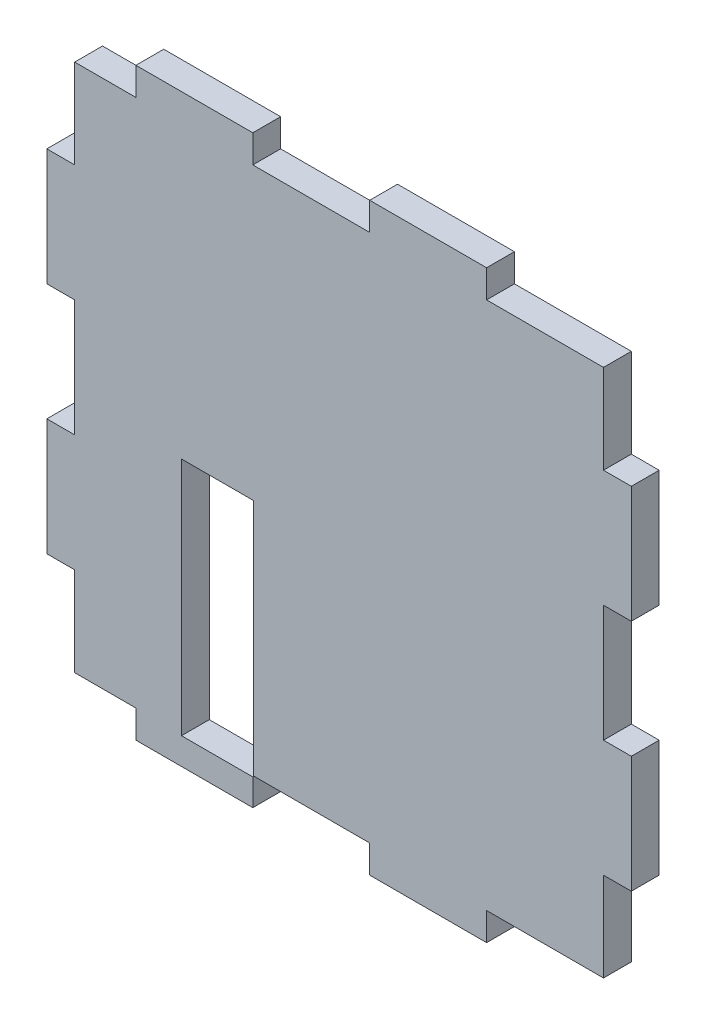
ISO-10303-21;
HEADER;
FILE_DESCRIPTION(('STEP AP214'),'2;1');
FILE_NAME('part.step','',(''),(''),'','','');
FILE_SCHEMA(('AUTOMOTIVE_DESIGN { 1 0 10303 214 1 1 1 1 }'));
ENDSEC;
DATA;
#1=APPLICATION_CONTEXT('core data for automotive mechanical design processes');
#2=APPLICATION_PROTOCOL_DEFINITION('international standard','automotive_design',2000,#1);
#3=PRODUCT_CONTEXT('',#1,'mechanical');
#4=PRODUCT('Part','Part','',(#3));
#5=PRODUCT_RELATED_PRODUCT_CATEGORY('part','',(#4));
#6=PRODUCT_DEFINITION_FORMATION('','',#4);
#7=PRODUCT_DEFINITION_CONTEXT('part definition',#1,'design');
#8=PRODUCT_DEFINITION('design','',#6,#7);
#9=PRODUCT_DEFINITION_SHAPE('','',#8);
#10=(LENGTH_UNIT() NAMED_UNIT(*) SI_UNIT(.MILLI.,.METRE.));
#11=(NAMED_UNIT(*) PLANE_ANGLE_UNIT() SI_UNIT($,.RADIAN.));
#12=(NAMED_UNIT(*) SI_UNIT($,.STERADIAN.) SOLID_ANGLE_UNIT());
#13=UNCERTAINTY_MEASURE_WITH_UNIT(LENGTH_MEASURE(1.E-05),#10,'distance_accuracy_value','');
#14=(GEOMETRIC_REPRESENTATION_CONTEXT(3) GLOBAL_UNCERTAINTY_ASSIGNED_CONTEXT((#13)) GLOBAL_UNIT_ASSIGNED_CONTEXT((#10,
#11,#12)) REPRESENTATION_CONTEXT('',''));
#15=CARTESIAN_POINT('',(0.,0.,0.));
#16=DIRECTION('',(0.,0.,1.));
#17=DIRECTION('',(1.,0.,0.));
#18=AXIS2_PLACEMENT_3D('',#15,#16,#17);
#19=CARTESIAN_POINT('',(0.,0.,0.));
#20=DIRECTION('',(0.,0.,1.));
#21=DIRECTION('',(1.,0.,0.));
#22=AXIS2_PLACEMENT_3D('',#19,#20,#21);
#23=PLANE('',#22);
#24=DIRECTION('',(1.,0.,0.));
#25=VECTOR('',#24,1.);
#26=CARTESIAN_POINT('',(0.,45.5655,0.));
#27=LINE('',#26,#25);
#28=CARTESIAN_POINT('',(-72.2,45.5655,0.));
#29=VERTEX_POINT('',#28);
#30=CARTESIAN_POINT('',(-59.878,45.5655,0.));
#31=VERTEX_POINT('',#30);
#32=EDGE_CURVE('E321',#29,#31,#27,.T.);
#33=ORIENTED_EDGE('',*,*,#32,.T.);
#34=DIRECTION('',(0.,-1.,0.));
#35=VECTOR('',#34,1.);
#36=CARTESIAN_POINT('',(-59.878,0.,0.));
#37=LINE('',#36,#35);
#38=CARTESIAN_POINT('',(-59.878,4.7625,0.));
#39=VERTEX_POINT('',#38);
#40=EDGE_CURVE('E302',#31,#39,#37,.T.);
#41=ORIENTED_EDGE('',*,*,#40,.T.);
#42=DIRECTION('',(1.,0.,0.));
#43=VECTOR('',#42,1.);
#44=CARTESIAN_POINT('',(4.7625,4.7625,0.));
#45=LINE('',#44,#43);
#46=CARTESIAN_POINT('',(-40.,4.7625,0.));
#47=VERTEX_POINT('',#46);
#48=EDGE_CURVE('E419',#39,#47,#45,.T.);
#49=ORIENTED_EDGE('',*,*,#48,.T.);
#50=DIRECTION('',(0.,1.,0.));
#51=VECTOR('',#50,1.);
#52=CARTESIAN_POINT('',(-40.,0.,0.));
#53=LINE('',#52,#51);
#54=CARTESIAN_POINT('',(-40.,0.,0.));
#55=VERTEX_POINT('',#54);
#56=EDGE_CURVE('E399',#55,#47,#53,.T.);
#57=ORIENTED_EDGE('',*,*,#56,.F.);
#58=DIRECTION('',(1.,0.,0.));
#59=VECTOR('',#58,1.);
#60=CARTESIAN_POINT('',(4.7625,0.,0.));
#61=LINE('',#60,#59);
#62=CARTESIAN_POINT('',(-20.,0.,0.));
#63=VERTEX_POINT('',#62);
#64=EDGE_CURVE('E564',#55,#63,#61,.T.);
#65=ORIENTED_EDGE('',*,*,#64,.T.);
#66=DIRECTION('',(0.,1.,0.));
#67=VECTOR('',#66,1.);
#68=CARTESIAN_POINT('',(-20.,0.,0.));
#69=LINE('',#68,#67);
#70=CARTESIAN_POINT('',(-20.,4.7625,0.));
#71=VERTEX_POINT('',#70);
#72=EDGE_CURVE('E409',#63,#71,#69,.T.);
#73=ORIENTED_EDGE('',*,*,#72,.T.);
#74=CARTESIAN_POINT('',(0.,4.7625,0.));
#75=VERTEX_POINT('',#74);
#76=EDGE_CURVE('E416',#71,#75,#45,.T.);
#77=ORIENTED_EDGE('',*,*,#76,.T.);
#78=DIRECTION('',(0.,1.,0.));
#79=VECTOR('',#78,1.);
#80=CARTESIAN_POINT('',(0.,0.,0.));
#81=LINE('',#80,#79);
#82=CARTESIAN_POINT('',(0.,20.,0.));
#83=VERTEX_POINT('',#82);
#84=EDGE_CURVE('E466',#75,#83,#81,.T.);
#85=ORIENTED_EDGE('',*,*,#84,.T.);
#86=DIRECTION('',(1.,0.,0.));
#87=VECTOR('',#86,1.);
#88=CARTESIAN_POINT('',(0.,20.,0.));
#89=LINE('',#88,#87);
#90=CARTESIAN_POINT('',(4.7625,20.,0.));
#91=VERTEX_POINT('',#90);
#92=EDGE_CURVE('E462',#83,#91,#89,.T.);
#93=ORIENTED_EDGE('',*,*,#92,.T.);
#94=DIRECTION('',(0.,1.,0.));
#95=VECTOR('',#94,1.);
#96=CARTESIAN_POINT('',(4.7625,0.,0.));
#97=LINE('',#96,#95);
#98=CARTESIAN_POINT('',(4.7625,40.,0.));
#99=VERTEX_POINT('',#98);
#100=EDGE_CURVE('E555',#91,#99,#97,.T.);
#101=ORIENTED_EDGE('',*,*,#100,.T.);
#102=DIRECTION('',(1.,0.,0.));
#103=VECTOR('',#102,1.);
#104=CARTESIAN_POINT('',(0.,40.,0.));
#105=LINE('',#104,#103);
#106=CARTESIAN_POINT('',(0.,40.,0.));
#107=VERTEX_POINT('',#106);
#108=EDGE_CURVE('E452',#107,#99,#105,.T.);
#109=ORIENTED_EDGE('',*,*,#108,.F.);
#110=CARTESIAN_POINT('',(0.,60.,2.08166817117217E-13));
#111=VERTEX_POINT('',#110);
#112=EDGE_CURVE('E470',#107,#111,#81,.T.);
#113=ORIENTED_EDGE('',*,*,#112,.T.);
#114=DIRECTION('',(1.,0.,0.));
#115=VECTOR('',#114,1.);
#116=CARTESIAN_POINT('',(0.,60.,2.08166817117217E-13));
#117=LINE('',#116,#115);
#118=CARTESIAN_POINT('',(4.7625,60.,0.));
#119=VERTEX_POINT('',#118);
#120=EDGE_CURVE('E424',#111,#119,#117,.T.);
#121=ORIENTED_EDGE('',*,*,#120,.T.);
#122=CARTESIAN_POINT('',(4.7625,80.,2.08166817117217E-13));
#123=VERTEX_POINT('',#122);
#124=EDGE_CURVE('E552',#119,#123,#97,.T.);
#125=ORIENTED_EDGE('',*,*,#124,.T.);
#126=DIRECTION('',(1.,0.,0.));
#127=VECTOR('',#126,1.);
#128=CARTESIAN_POINT('',(0.,80.,2.08166817117217E-13));
#129=LINE('',#128,#127);
#130=CARTESIAN_POINT('',(0.,80.,0.));
#131=VERTEX_POINT('',#130);
#132=EDGE_CURVE('E431',#131,#123,#129,.T.);
#133=ORIENTED_EDGE('',*,*,#132,.F.);
#134=CARTESIAN_POINT('',(0.,95.2375,0.));
#135=VERTEX_POINT('',#134);
#136=EDGE_CURVE('E459',#131,#135,#81,.T.);
#137=ORIENTED_EDGE('',*,*,#136,.T.);
#138=DIRECTION('',(1.,0.,0.));
#139=VECTOR('',#138,1.);
#140=CARTESIAN_POINT('',(-20.,95.2375,0.));
#141=LINE('',#140,#139);
#142=CARTESIAN_POINT('',(-20.,95.2375,0.));
#143=VERTEX_POINT('',#142);
#144=EDGE_CURVE('E478',#143,#135,#141,.T.);
#145=ORIENTED_EDGE('',*,*,#144,.F.);
#146=DIRECTION('',(0.,1.,0.));
#147=VECTOR('',#146,1.);
#148=CARTESIAN_POINT('',(-20.,95.2375,0.));
#149=LINE('',#148,#147);
#150=CARTESIAN_POINT('',(-20.,100.,0.));
#151=VERTEX_POINT('',#150);
#152=EDGE_CURVE('E512',#143,#151,#149,.T.);
#153=ORIENTED_EDGE('',*,*,#152,.T.);
#154=DIRECTION('',(-1.,0.,0.));
#155=VECTOR('',#154,1.);
#156=CARTESIAN_POINT('',(4.7625,100.,0.));
#157=LINE('',#156,#155);
#158=CARTESIAN_POINT('',(-40.,100.,0.));
#159=VERTEX_POINT('',#158);
#160=EDGE_CURVE('E559',#151,#159,#157,.T.);
#161=ORIENTED_EDGE('',*,*,#160,.T.);
#162=DIRECTION('',(0.,1.,0.));
#163=VECTOR('',#162,1.);
#164=CARTESIAN_POINT('',(-40.,95.2375,0.));
#165=LINE('',#164,#163);
#166=CARTESIAN_POINT('',(-40.,95.2375,0.));
#167=VERTEX_POINT('',#166);
#168=EDGE_CURVE('E494',#167,#159,#165,.T.);
#169=ORIENTED_EDGE('',*,*,#168,.F.);
#170=DIRECTION('',(1.,0.,0.));
#171=VECTOR('',#170,1.);
#172=CARTESIAN_POINT('',(-60.,95.2375,0.));
#173=LINE('',#172,#171);
#174=CARTESIAN_POINT('',(-60.,95.2375,0.));
#175=VERTEX_POINT('',#174);
#176=EDGE_CURVE('E56',#175,#167,#173,.T.);
#177=ORIENTED_EDGE('',*,*,#176,.F.);
#178=DIRECTION('',(0.,1.,0.));
#179=VECTOR('',#178,1.);
#180=CARTESIAN_POINT('',(-60.,95.2375,0.));
#181=LINE('',#180,#179);
#182=CARTESIAN_POINT('',(-60.,100.,0.));
#183=VERTEX_POINT('',#182);
#184=EDGE_CURVE('E501',#175,#183,#181,.T.);
#185=ORIENTED_EDGE('',*,*,#184,.T.);
#186=CARTESIAN_POINT('',(-80.,100.,0.));
#187=VERTEX_POINT('',#186);
#188=EDGE_CURVE('E556',#183,#187,#157,.T.);
#189=ORIENTED_EDGE('',*,*,#188,.T.);
#190=DIRECTION('',(0.,1.,0.));
#191=VECTOR('',#190,1.);
#192=CARTESIAN_POINT('',(-80.,95.2375,0.));
#193=LINE('',#192,#191);
#194=CARTESIAN_POINT('',(-80.,95.2375,0.));
#195=VERTEX_POINT('',#194);
#196=EDGE_CURVE('E510',#195,#187,#193,.T.);
#197=ORIENTED_EDGE('',*,*,#196,.F.);
#198=DIRECTION('',(1.,0.,0.));
#199=VECTOR('',#198,1.);
#200=CARTESIAN_POINT('',(-90.475,95.2375,0.));
#201=LINE('',#200,#199);
#202=CARTESIAN_POINT('',(-90.475,95.2375,0.));
#203=VERTEX_POINT('',#202);
#204=EDGE_CURVE('E486',#203,#195,#201,.T.);
#205=ORIENTED_EDGE('',*,*,#204,.F.);
#206=DIRECTION('',(0.,1.,0.));
#207=VECTOR('',#206,1.);
#208=CARTESIAN_POINT('',(-90.475,80.,2.08166817117217E-13));
#209=LINE('',#208,#207);
#210=CARTESIAN_POINT('',(-90.475,80.,2.08166817117217E-13));
#211=VERTEX_POINT('',#210);
#212=EDGE_CURVE('E343',#211,#203,#209,.T.);
#213=ORIENTED_EDGE('',*,*,#212,.F.);
#214=DIRECTION('',(1.,0.,0.));
#215=VECTOR('',#214,1.);
#216=CARTESIAN_POINT('',(-95.2375,80.,2.08166817117217E-13));
#217=LINE('',#216,#215);
#218=CARTESIAN_POINT('',(-95.2375,80.,0.));
#219=VERTEX_POINT('',#218);
#220=EDGE_CURVE('E358',#219,#211,#217,.T.);
#221=ORIENTED_EDGE('',*,*,#220,.F.);
#222=DIRECTION('',(0.,-1.,0.));
#223=VECTOR('',#222,1.);
#224=CARTESIAN_POINT('',(-95.2375,0.,0.));
#225=LINE('',#224,#223);
#226=CARTESIAN_POINT('',(-95.2375,60.,2.08166817117217E-13));
#227=VERTEX_POINT('',#226);
#228=EDGE_CURVE('E563',#219,#227,#225,.T.);
#229=ORIENTED_EDGE('',*,*,#228,.T.);
#230=DIRECTION('',(1.,0.,0.));
#231=VECTOR('',#230,1.);
#232=CARTESIAN_POINT('',(-95.2375,60.,2.08166817117217E-13));
#233=LINE('',#232,#231);
#234=CARTESIAN_POINT('',(-90.475,60.,0.));
#235=VERTEX_POINT('',#234);
#236=EDGE_CURVE('E367',#227,#235,#233,.T.);
#237=ORIENTED_EDGE('',*,*,#236,.T.);
#238=DIRECTION('',(0.,1.,0.));
#239=VECTOR('',#238,1.);
#240=CARTESIAN_POINT('',(-90.475,40.,0.));
#241=LINE('',#240,#239);
#242=CARTESIAN_POINT('',(-90.475,40.,0.));
#243=VERTEX_POINT('',#242);
#244=EDGE_CURVE('E336',#243,#235,#241,.T.);
#245=ORIENTED_EDGE('',*,*,#244,.F.);
#246=DIRECTION('',(1.,0.,0.));
#247=VECTOR('',#246,1.);
#248=CARTESIAN_POINT('',(-95.2375,40.,0.));
#249=LINE('',#248,#247);
#250=CARTESIAN_POINT('',(-95.2375,40.,0.));
#251=VERTEX_POINT('',#250);
#252=EDGE_CURVE('E370',#251,#243,#249,.T.);
#253=ORIENTED_EDGE('',*,*,#252,.F.);
#254=CARTESIAN_POINT('',(-95.2375,20.,0.));
#255=VERTEX_POINT('',#254);
#256=EDGE_CURVE('E560',#251,#255,#225,.T.);
#257=ORIENTED_EDGE('',*,*,#256,.T.);
#258=DIRECTION('',(1.,0.,0.));
#259=VECTOR('',#258,1.);
#260=CARTESIAN_POINT('',(-95.2375,20.,0.));
#261=LINE('',#260,#259);
#262=CARTESIAN_POINT('',(-90.475,20.,0.));
#263=VERTEX_POINT('',#262);
#264=EDGE_CURVE('E355',#255,#263,#261,.T.);
#265=ORIENTED_EDGE('',*,*,#264,.T.);
#266=DIRECTION('',(0.,1.,0.));
#267=VECTOR('',#266,1.);
#268=CARTESIAN_POINT('',(-90.475,0.,0.));
#269=LINE('',#268,#267);
#270=CARTESIAN_POINT('',(-90.475,4.7625,0.));
#271=VERTEX_POINT('',#270);
#272=EDGE_CURVE('E346',#271,#263,#269,.T.);
#273=ORIENTED_EDGE('',*,*,#272,.F.);
#274=CARTESIAN_POINT('',(-80.,4.7625,0.));
#275=VERTEX_POINT('',#274);
#276=EDGE_CURVE('E420',#271,#275,#45,.T.);
#277=ORIENTED_EDGE('',*,*,#276,.T.);
#278=DIRECTION('',(0.,1.,0.));
#279=VECTOR('',#278,1.);
#280=CARTESIAN_POINT('',(-80.,0.,0.));
#281=LINE('',#280,#279);
#282=CARTESIAN_POINT('',(-80.,0.,0.));
#283=VERTEX_POINT('',#282);
#284=EDGE_CURVE('E378',#283,#275,#281,.T.);
#285=ORIENTED_EDGE('',*,*,#284,.F.);
#286=CARTESIAN_POINT('',(-60.,0.,0.));
#287=VERTEX_POINT('',#286);
#288=EDGE_CURVE('E539',#283,#287,#61,.T.);
#289=ORIENTED_EDGE('',*,*,#288,.T.);
#290=DIRECTION('',(0.,1.,0.));
#291=VECTOR('',#290,1.);
#292=CARTESIAN_POINT('',(-60.,0.,0.));
#293=LINE('',#292,#291);
#294=CARTESIAN_POINT('',(-60.,4.5595,0.));
#295=VERTEX_POINT('',#294);
#296=EDGE_CURVE('E388',#287,#295,#293,.T.);
#297=ORIENTED_EDGE('',*,*,#296,.T.);
#298=DIRECTION('',(-1.,0.,0.));
#299=VECTOR('',#298,1.);
#300=CARTESIAN_POINT('',(0.,4.55950000000002,0.));
#301=LINE('',#300,#299);
#302=CARTESIAN_POINT('',(-72.2,4.55949999999999,0.));
#303=VERTEX_POINT('',#302);
#304=EDGE_CURVE('E316',#295,#303,#301,.T.);
#305=ORIENTED_EDGE('',*,*,#304,.T.);
#306=DIRECTION('',(0.,-1.,0.));
#307=VECTOR('',#306,1.);
#308=CARTESIAN_POINT('',(-72.2,0.,0.));
#309=LINE('',#308,#307);
#310=EDGE_CURVE('E319',#29,#303,#309,.T.);
#311=ORIENTED_EDGE('',*,*,#310,.F.);
#312=EDGE_LOOP('',(#33,#41,#49,#57,#65,#73,#77,#85,#93,#101,#109,#113,#121,#125,#133,#137,#145,
#153,#161,#169,#177,#185,#189,#197,#205,#213,#221,#229,#237,#245,#253,#257,#265,#273,#277,#285,
#289,#297,#305,#311));
#313=FACE_BOUND('',#312,.T.);
#314=ADVANCED_FACE('F33',(#313),#23,.T.);
#315=CARTESIAN_POINT('',(0.,0.,-4.7625));
#316=DIRECTION('',(0.,0.,1.));
#317=DIRECTION('',(1.,0.,0.));
#318=AXIS2_PLACEMENT_3D('',#315,#316,#317);
#319=PLANE('',#318);
#320=DIRECTION('',(0.,-1.,0.));
#321=VECTOR('',#320,1.);
#322=CARTESIAN_POINT('',(-59.878,0.,-4.7625));
#323=LINE('',#322,#321);
#324=CARTESIAN_POINT('',(-59.878,45.5655,-4.7625));
#325=VERTEX_POINT('',#324);
#326=CARTESIAN_POINT('',(-59.878,4.7625,-4.7625));
#327=VERTEX_POINT('',#326);
#328=EDGE_CURVE('E48',#325,#327,#323,.T.);
#329=ORIENTED_EDGE('',*,*,#328,.F.);
#330=DIRECTION('',(1.,0.,0.));
#331=VECTOR('',#330,1.);
#332=CARTESIAN_POINT('',(0.,45.5655,-4.7625));
#333=LINE('',#332,#331);
#334=CARTESIAN_POINT('',(-72.2,45.5655,-4.7625));
#335=VERTEX_POINT('',#334);
#336=EDGE_CURVE('E11',#335,#325,#333,.T.);
#337=ORIENTED_EDGE('',*,*,#336,.F.);
#338=DIRECTION('',(0.,-1.,0.));
#339=VECTOR('',#338,1.);
#340=CARTESIAN_POINT('',(-72.2,0.,-4.7625));
#341=LINE('',#340,#339);
#342=CARTESIAN_POINT('',(-72.2,4.55949999999999,-4.7625));
#343=VERTEX_POINT('',#342);
#344=EDGE_CURVE('E41',#335,#343,#341,.T.);
#345=ORIENTED_EDGE('',*,*,#344,.T.);
#346=DIRECTION('',(-1.,0.,0.));
#347=VECTOR('',#346,1.);
#348=CARTESIAN_POINT('',(0.,4.55950000000002,-4.7625));
#349=LINE('',#348,#347);
#350=CARTESIAN_POINT('',(-60.,4.5595,-4.76249999999999));
#351=VERTEX_POINT('',#350);
#352=EDGE_CURVE('E310',#351,#343,#349,.T.);
#353=ORIENTED_EDGE('',*,*,#352,.F.);
#354=DIRECTION('',(0.,1.,0.));
#355=VECTOR('',#354,1.);
#356=CARTESIAN_POINT('',(-60.,0.,-4.76249999999999));
#357=LINE('',#356,#355);
#358=CARTESIAN_POINT('',(-60.,0.,-4.76249999999999));
#359=VERTEX_POINT('',#358);
#360=EDGE_CURVE('E385',#359,#351,#357,.T.);
#361=ORIENTED_EDGE('',*,*,#360,.F.);
#362=DIRECTION('',(1.,0.,0.));
#363=VECTOR('',#362,1.);
#364=CARTESIAN_POINT('',(4.7625,0.,-4.7625));
#365=LINE('',#364,#363);
#366=CARTESIAN_POINT('',(-80.,0.,-4.76249999999999));
#367=VERTEX_POINT('',#366);
#368=EDGE_CURVE('E551',#367,#359,#365,.T.);
#369=ORIENTED_EDGE('',*,*,#368,.F.);
#370=DIRECTION('',(0.,1.,0.));
#371=VECTOR('',#370,1.);
#372=CARTESIAN_POINT('',(-80.,0.,-4.76249999999999));
#373=LINE('',#372,#371);
#374=CARTESIAN_POINT('',(-80.,4.7625,-4.76249999999999));
#375=VERTEX_POINT('',#374);
#376=EDGE_CURVE('E381',#367,#375,#373,.T.);
#377=ORIENTED_EDGE('',*,*,#376,.T.);
#378=DIRECTION('',(1.,0.,0.));
#379=VECTOR('',#378,1.);
#380=CARTESIAN_POINT('',(0.,4.7625,-4.7625));
#381=LINE('',#380,#379);
#382=CARTESIAN_POINT('',(-90.475,4.7625,-4.7625));
#383=VERTEX_POINT('',#382);
#384=EDGE_CURVE('E522',#383,#375,#381,.T.);
#385=ORIENTED_EDGE('',*,*,#384,.F.);
#386=DIRECTION('',(0.,-1.,0.));
#387=VECTOR('',#386,1.);
#388=CARTESIAN_POINT('',(-90.475,0.,-4.7625));
#389=LINE('',#388,#387);
#390=CARTESIAN_POINT('',(-90.475,20.,-4.76250000000001));
#391=VERTEX_POINT('',#390);
#392=EDGE_CURVE('E523',#391,#383,#389,.T.);
#393=ORIENTED_EDGE('',*,*,#392,.F.);
#394=DIRECTION('',(1.,0.,0.));
#395=VECTOR('',#394,1.);
#396=CARTESIAN_POINT('',(-95.2375,20.,-4.76250000000001));
#397=LINE('',#396,#395);
#398=CARTESIAN_POINT('',(-95.2375,20.,-4.76250000000001));
#399=VERTEX_POINT('',#398);
#400=EDGE_CURVE('E352',#399,#391,#397,.T.);
#401=ORIENTED_EDGE('',*,*,#400,.F.);
#402=DIRECTION('',(0.,-1.,0.));
#403=VECTOR('',#402,1.);
#404=CARTESIAN_POINT('',(-95.2375,0.,-4.7625));
#405=LINE('',#404,#403);
#406=CARTESIAN_POINT('',(-95.2375,40.,-4.76250000000001));
#407=VERTEX_POINT('',#406);
#408=EDGE_CURVE('E544',#407,#399,#405,.T.);
#409=ORIENTED_EDGE('',*,*,#408,.F.);
#410=DIRECTION('',(1.,0.,0.));
#411=VECTOR('',#410,1.);
#412=CARTESIAN_POINT('',(-95.2375,40.,-4.76250000000001));
#413=LINE('',#412,#411);
#414=CARTESIAN_POINT('',(-90.475,40.,-4.76250000000001));
#415=VERTEX_POINT('',#414);
#416=EDGE_CURVE('E333',#407,#415,#413,.T.);
#417=ORIENTED_EDGE('',*,*,#416,.T.);
#418=CARTESIAN_POINT('',(-90.475,60.,-4.7624999999998));
#419=VERTEX_POINT('',#418);
#420=EDGE_CURVE('E525',#419,#415,#389,.T.);
#421=ORIENTED_EDGE('',*,*,#420,.F.);
#422=DIRECTION('',(1.,0.,0.));
#423=VECTOR('',#422,1.);
#424=CARTESIAN_POINT('',(-95.2375,60.,-4.7624999999998));
#425=LINE('',#424,#423);
#426=CARTESIAN_POINT('',(-95.2375,60.,-4.7624999999998));
#427=VERTEX_POINT('',#426);
#428=EDGE_CURVE('E364',#427,#419,#425,.T.);
#429=ORIENTED_EDGE('',*,*,#428,.F.);
#430=CARTESIAN_POINT('',(-95.2375,80.,-4.7624999999998));
#431=VERTEX_POINT('',#430);
#432=EDGE_CURVE('E547',#431,#427,#405,.T.);
#433=ORIENTED_EDGE('',*,*,#432,.F.);
#434=DIRECTION('',(1.,0.,0.));
#435=VECTOR('',#434,1.);
#436=CARTESIAN_POINT('',(-95.2375,80.,-4.7624999999998));
#437=LINE('',#436,#435);
#438=CARTESIAN_POINT('',(-90.475,80.,-4.7624999999998));
#439=VERTEX_POINT('',#438);
#440=EDGE_CURVE('E361',#431,#439,#437,.T.);
#441=ORIENTED_EDGE('',*,*,#440,.T.);
#442=CARTESIAN_POINT('',(-90.475,95.2375,-4.7625));
#443=VERTEX_POINT('',#442);
#444=EDGE_CURVE('E526',#443,#439,#389,.T.);
#445=ORIENTED_EDGE('',*,*,#444,.F.);
#446=DIRECTION('',(-1.,0.,0.));
#447=VECTOR('',#446,1.);
#448=CARTESIAN_POINT('',(0.,95.2375,-4.7625));
#449=LINE('',#448,#447);
#450=CARTESIAN_POINT('',(-80.,95.2375,-4.76249999999998));
#451=VERTEX_POINT('',#450);
#452=EDGE_CURVE('E531',#451,#443,#449,.T.);
#453=ORIENTED_EDGE('',*,*,#452,.F.);
#454=DIRECTION('',(0.,1.,0.));
#455=VECTOR('',#454,1.);
#456=CARTESIAN_POINT('',(-80.,95.2375,-4.76249999999998));
#457=LINE('',#456,#455);
#458=CARTESIAN_POINT('',(-80.,100.,-4.76249999999998));
#459=VERTEX_POINT('',#458);
#460=EDGE_CURVE('E507',#451,#459,#457,.T.);
#461=ORIENTED_EDGE('',*,*,#460,.T.);
#462=DIRECTION('',(-1.,0.,0.));
#463=VECTOR('',#462,1.);
#464=CARTESIAN_POINT('',(4.7625,100.,-4.7625));
#465=LINE('',#464,#463);
#466=CARTESIAN_POINT('',(-60.,100.,-4.76249999999998));
#467=VERTEX_POINT('',#466);
#468=EDGE_CURVE('E540',#467,#459,#465,.T.);
#469=ORIENTED_EDGE('',*,*,#468,.F.);
#470=DIRECTION('',(0.,1.,0.));
#471=VECTOR('',#470,1.);
#472=CARTESIAN_POINT('',(-60.,95.2375,-4.76249999999998));
#473=LINE('',#472,#471);
#474=CARTESIAN_POINT('',(-60.,95.2375,-4.76249999999998));
#475=VERTEX_POINT('',#474);
#476=EDGE_CURVE('E505',#475,#467,#473,.T.);
#477=ORIENTED_EDGE('',*,*,#476,.F.);
#478=CARTESIAN_POINT('',(-40.,95.2375,-4.76249999999998));
#479=VERTEX_POINT('',#478);
#480=EDGE_CURVE('E533',#479,#475,#449,.T.);
#481=ORIENTED_EDGE('',*,*,#480,.F.);
#482=DIRECTION('',(0.,1.,0.));
#483=VECTOR('',#482,1.);
#484=CARTESIAN_POINT('',(-40.,95.2375,-4.76249999999998));
#485=LINE('',#484,#483);
#486=CARTESIAN_POINT('',(-40.,100.,-4.76249999999998));
#487=VERTEX_POINT('',#486);
#488=EDGE_CURVE('E517',#479,#487,#485,.T.);
#489=ORIENTED_EDGE('',*,*,#488,.T.);
#490=CARTESIAN_POINT('',(-20.,100.,-4.76249999999998));
#491=VERTEX_POINT('',#490);
#492=EDGE_CURVE('E543',#491,#487,#465,.T.);
#493=ORIENTED_EDGE('',*,*,#492,.F.);
#494=DIRECTION('',(0.,1.,0.));
#495=VECTOR('',#494,1.);
#496=CARTESIAN_POINT('',(-20.,95.2375,-4.76249999999998));
#497=LINE('',#496,#495);
#498=CARTESIAN_POINT('',(-20.,95.2375,-4.76249999999998));
#499=VERTEX_POINT('',#498);
#500=EDGE_CURVE('E515',#499,#491,#497,.T.);
#501=ORIENTED_EDGE('',*,*,#500,.F.);
#502=CARTESIAN_POINT('',(0.,95.2375,-4.7625));
#503=VERTEX_POINT('',#502);
#504=EDGE_CURVE('E534',#503,#499,#449,.T.);
#505=ORIENTED_EDGE('',*,*,#504,.F.);
#506=DIRECTION('',(0.,1.,0.));
#507=VECTOR('',#506,1.);
#508=CARTESIAN_POINT('',(0.,0.,-4.7625));
#509=LINE('',#508,#507);
#510=CARTESIAN_POINT('',(0.,80.,-4.7624999999998));
#511=VERTEX_POINT('',#510);
#512=EDGE_CURVE('E527',#511,#503,#509,.T.);
#513=ORIENTED_EDGE('',*,*,#512,.F.);
#514=DIRECTION('',(1.,0.,0.));
#515=VECTOR('',#514,1.);
#516=CARTESIAN_POINT('',(0.,80.,-4.7624999999998));
#517=LINE('',#516,#515);
#518=CARTESIAN_POINT('',(4.7625,80.,-4.7624999999998));
#519=VERTEX_POINT('',#518);
#520=EDGE_CURVE('E428',#511,#519,#517,.T.);
#521=ORIENTED_EDGE('',*,*,#520,.T.);
#522=DIRECTION('',(0.,1.,0.));
#523=VECTOR('',#522,1.);
#524=CARTESIAN_POINT('',(4.7625,0.,-4.7625));
#525=LINE('',#524,#523);
#526=CARTESIAN_POINT('',(4.7625,60.,-4.7624999999998));
#527=VERTEX_POINT('',#526);
#528=EDGE_CURVE('E535',#527,#519,#525,.T.);
#529=ORIENTED_EDGE('',*,*,#528,.F.);
#530=DIRECTION('',(1.,0.,0.));
#531=VECTOR('',#530,1.);
#532=CARTESIAN_POINT('',(0.,60.,-4.7624999999998));
#533=LINE('',#532,#531);
#534=CARTESIAN_POINT('',(0.,60.,-4.7624999999998));
#535=VERTEX_POINT('',#534);
#536=EDGE_CURVE('E425',#535,#527,#533,.T.);
#537=ORIENTED_EDGE('',*,*,#536,.F.);
#538=CARTESIAN_POINT('',(0.,40.,-4.76250000000001));
#539=VERTEX_POINT('',#538);
#540=EDGE_CURVE('E529',#539,#535,#509,.T.);
#541=ORIENTED_EDGE('',*,*,#540,.F.);
#542=DIRECTION('',(1.,0.,0.));
#543=VECTOR('',#542,1.);
#544=CARTESIAN_POINT('',(0.,40.,-4.76250000000001));
#545=LINE('',#544,#543);
#546=CARTESIAN_POINT('',(4.7625,40.,-4.76250000000001));
#547=VERTEX_POINT('',#546);
#548=EDGE_CURVE('E456',#539,#547,#545,.T.);
#549=ORIENTED_EDGE('',*,*,#548,.T.);
#550=CARTESIAN_POINT('',(4.7625,20.,-4.76250000000001));
#551=VERTEX_POINT('',#550);
#552=EDGE_CURVE('E538',#551,#547,#525,.T.);
#553=ORIENTED_EDGE('',*,*,#552,.F.);
#554=DIRECTION('',(1.,0.,0.));
#555=VECTOR('',#554,1.);
#556=CARTESIAN_POINT('',(0.,20.,-4.76250000000001));
#557=LINE('',#556,#555);
#558=CARTESIAN_POINT('',(0.,20.,-4.76250000000001));
#559=VERTEX_POINT('',#558);
#560=EDGE_CURVE('E460',#559,#551,#557,.T.);
#561=ORIENTED_EDGE('',*,*,#560,.F.);
#562=CARTESIAN_POINT('',(0.,4.7625,-4.7625));
#563=VERTEX_POINT('',#562);
#564=EDGE_CURVE('E530',#563,#559,#509,.T.);
#565=ORIENTED_EDGE('',*,*,#564,.F.);
#566=CARTESIAN_POINT('',(-20.,4.7625,-4.76249999999999));
#567=VERTEX_POINT('',#566);
#568=EDGE_CURVE('E504',#567,#563,#381,.T.);
#569=ORIENTED_EDGE('',*,*,#568,.F.);
#570=DIRECTION('',(0.,1.,0.));
#571=VECTOR('',#570,1.);
#572=CARTESIAN_POINT('',(-20.,0.,-4.76249999999999));
#573=LINE('',#572,#571);
#574=CARTESIAN_POINT('',(-20.,0.,-4.76249999999999));
#575=VERTEX_POINT('',#574);
#576=EDGE_CURVE('E407',#575,#567,#573,.T.);
#577=ORIENTED_EDGE('',*,*,#576,.F.);
#578=CARTESIAN_POINT('',(-40.,0.,-4.76249999999999));
#579=VERTEX_POINT('',#578);
#580=EDGE_CURVE('E548',#579,#575,#365,.T.);
#581=ORIENTED_EDGE('',*,*,#580,.F.);
#582=DIRECTION('',(0.,1.,0.));
#583=VECTOR('',#582,1.);
#584=CARTESIAN_POINT('',(-40.,0.,-4.76249999999999));
#585=LINE('',#584,#583);
#586=CARTESIAN_POINT('',(-40.,4.7625,-4.76249999999999));
#587=VERTEX_POINT('',#586);
#588=EDGE_CURVE('E404',#579,#587,#585,.T.);
#589=ORIENTED_EDGE('',*,*,#588,.T.);
#590=EDGE_CURVE('E308',#327,#587,#381,.T.);
#591=ORIENTED_EDGE('',*,*,#590,.F.);
#592=EDGE_LOOP('',(#329,#337,#345,#353,#361,#369,#377,#385,#393,#401,#409,#417,#421,#429,#433,
#441,#445,#453,#461,#469,#477,#481,#489,#493,#501,#505,#513,#521,#529,#537,#541,#549,#553,#561,
#565,#569,#577,#581,#589,#591));
#593=FACE_BOUND('',#592,.T.);
#594=ADVANCED_FACE('F306',(#593),#319,.F.);
#595=CARTESIAN_POINT('',(-60.,0.,-50.));
#596=DIRECTION('',(1.,0.,0.));
#597=DIRECTION('',(0.,0.,-1.));
#598=AXIS2_PLACEMENT_3D('',#595,#596,#597);
#599=PLANE('',#598);
#600=ORIENTED_EDGE('',*,*,#360,.T.);
#601=DIRECTION('',(0.,0.,1.));
#602=VECTOR('',#601,1.);
#603=CARTESIAN_POINT('',(-60.,4.5595,-50.));
#604=LINE('',#603,#602);
#605=EDGE_CURVE('E569',#351,#295,#604,.T.);
#606=ORIENTED_EDGE('',*,*,#605,.T.);
#607=ORIENTED_EDGE('',*,*,#296,.F.);
#608=DIRECTION('',(0.,0.,-1.));
#609=VECTOR('',#608,1.);
#610=CARTESIAN_POINT('',(-60.,0.,-50.));
#611=LINE('',#610,#609);
#612=EDGE_CURVE('E376',#287,#359,#611,.T.);
#613=ORIENTED_EDGE('',*,*,#612,.T.);
#614=EDGE_LOOP('',(#600,#606,#607,#613));
#615=FACE_BOUND('',#614,.T.);
#616=ADVANCED_FACE('F586',(#615),#599,.T.);
#617=CARTESIAN_POINT('',(-45.2375,4.7625,-50.));
#618=DIRECTION('',(0.,-1.,0.));
#619=DIRECTION('',(-1.,0.,0.));
#620=AXIS2_PLACEMENT_3D('',#617,#618,#619);
#621=PLANE('',#620);
#622=ORIENTED_EDGE('',*,*,#48,.F.);
#623=DIRECTION('',(0.,0.,-1.));
#624=VECTOR('',#623,1.);
#625=CARTESIAN_POINT('',(-59.878,4.7625,-50.));
#626=LINE('',#625,#624);
#627=EDGE_CURVE('E567',#39,#327,#626,.T.);
#628=ORIENTED_EDGE('',*,*,#627,.T.);
#629=ORIENTED_EDGE('',*,*,#590,.T.);
#630=DIRECTION('',(0.,0.,-1.));
#631=VECTOR('',#630,1.);
#632=CARTESIAN_POINT('',(-40.,4.7625,-50.));
#633=LINE('',#632,#631);
#634=EDGE_CURVE('E384',#47,#587,#633,.T.);
#635=ORIENTED_EDGE('',*,*,#634,.F.);
#636=EDGE_LOOP('',(#622,#628,#629,#635));
#637=FACE_BOUND('',#636,.T.);
#638=ADVANCED_FACE('F603',(#637),#621,.T.);
#639=CARTESIAN_POINT('',(4.7625,0.,-4.7625));
#640=DIRECTION('',(1.,0.,0.));
#641=DIRECTION('',(0.,0.,-1.));
#642=AXIS2_PLACEMENT_3D('',#639,#640,#641);
#643=PLANE('',#642);
#644=DIRECTION('',(0.,0.,-1.));
#645=VECTOR('',#644,1.);
#646=CARTESIAN_POINT('',(4.7625,40.,-50.));
#647=LINE('',#646,#645);
#648=EDGE_CURVE('E441',#99,#547,#647,.T.);
#649=ORIENTED_EDGE('',*,*,#648,.F.);
#650=ORIENTED_EDGE('',*,*,#100,.F.);
#651=DIRECTION('',(0.,0.,-1.));
#652=VECTOR('',#651,1.);
#653=CARTESIAN_POINT('',(4.7625,20.,-50.));
#654=LINE('',#653,#652);
#655=EDGE_CURVE('E449',#91,#551,#654,.T.);
#656=ORIENTED_EDGE('',*,*,#655,.T.);
#657=ORIENTED_EDGE('',*,*,#552,.T.);
#658=EDGE_LOOP('',(#649,#650,#656,#657));
#659=FACE_BOUND('',#658,.T.);
#660=ADVANCED_FACE('F35',(#659),#643,.T.);
#661=ORIENTED_EDGE('',*,*,#124,.F.);
#662=DIRECTION('',(0.,0.,-1.));
#663=VECTOR('',#662,1.);
#664=CARTESIAN_POINT('',(4.7625,60.,2.08166817117217E-13));
#665=LINE('',#664,#663);
#666=EDGE_CURVE('E437',#119,#527,#665,.T.);
#667=ORIENTED_EDGE('',*,*,#666,.T.);
#668=ORIENTED_EDGE('',*,*,#528,.T.);
#669=DIRECTION('',(0.,0.,-1.));
#670=VECTOR('',#669,1.);
#671=CARTESIAN_POINT('',(4.7625,80.,2.08166817117217E-13));
#672=LINE('',#671,#670);
#673=EDGE_CURVE('E435',#123,#519,#672,.T.);
#674=ORIENTED_EDGE('',*,*,#673,.F.);
#675=EDGE_LOOP('',(#661,#667,#668,#674));
#676=FACE_BOUND('',#675,.T.);
#677=ADVANCED_FACE('F707',(#676),#643,.T.);
#678=CARTESIAN_POINT('',(4.7625,0.,-4.7625));
#679=DIRECTION('',(0.,-1.,0.));
#680=DIRECTION('',(0.,0.,-1.));
#681=AXIS2_PLACEMENT_3D('',#678,#679,#680);
#682=PLANE('',#681);
#683=DIRECTION('',(0.,0.,-1.));
#684=VECTOR('',#683,1.);
#685=CARTESIAN_POINT('',(-80.,0.,-50.));
#686=LINE('',#685,#684);
#687=EDGE_CURVE('E373',#283,#367,#686,.T.);
#688=ORIENTED_EDGE('',*,*,#687,.T.);
#689=ORIENTED_EDGE('',*,*,#368,.T.);
#690=ORIENTED_EDGE('',*,*,#612,.F.);
#691=ORIENTED_EDGE('',*,*,#288,.F.);
#692=EDGE_LOOP('',(#688,#689,#690,#691));
#693=FACE_BOUND('',#692,.T.);
#694=ADVANCED_FACE('F589',(#693),#682,.T.);
#695=DIRECTION('',(0.,0.,-1.));
#696=VECTOR('',#695,1.);
#697=CARTESIAN_POINT('',(-40.,0.,-50.));
#698=LINE('',#697,#696);
#699=EDGE_CURVE('E393',#55,#579,#698,.T.);
#700=ORIENTED_EDGE('',*,*,#699,.T.);
#701=ORIENTED_EDGE('',*,*,#580,.T.);
#702=DIRECTION('',(0.,0.,-1.));
#703=VECTOR('',#702,1.);
#704=CARTESIAN_POINT('',(-20.,0.,-50.));
#705=LINE('',#704,#703);
#706=EDGE_CURVE('E396',#63,#575,#705,.T.);
#707=ORIENTED_EDGE('',*,*,#706,.F.);
#708=ORIENTED_EDGE('',*,*,#64,.F.);
#709=EDGE_LOOP('',(#700,#701,#707,#708));
#710=FACE_BOUND('',#709,.T.);
#711=ADVANCED_FACE('F612',(#710),#682,.T.);
#712=CARTESIAN_POINT('',(-95.2375,0.,-4.7625));
#713=DIRECTION('',(-1.,0.,0.));
#714=DIRECTION('',(0.,0.,1.));
#715=AXIS2_PLACEMENT_3D('',#712,#713,#714);
#716=PLANE('',#715);
#717=ORIENTED_EDGE('',*,*,#256,.F.);
#718=DIRECTION('',(0.,0.,1.));
#719=VECTOR('',#718,1.);
#720=CARTESIAN_POINT('',(-95.2375,40.,-4.76250000000001));
#721=LINE('',#720,#719);
#722=EDGE_CURVE('E324',#407,#251,#721,.T.);
#723=ORIENTED_EDGE('',*,*,#722,.F.);
#724=ORIENTED_EDGE('',*,*,#408,.T.);
#725=DIRECTION('',(0.,0.,-1.));
#726=VECTOR('',#725,1.);
#727=CARTESIAN_POINT('',(-95.2375,20.,0.));
#728=LINE('',#727,#726);
#729=EDGE_CURVE('E331',#255,#399,#728,.T.);
#730=ORIENTED_EDGE('',*,*,#729,.F.);
#731=EDGE_LOOP('',(#717,#723,#724,#730));
#732=FACE_BOUND('',#731,.T.);
#733=ADVANCED_FACE('F623',(#732),#716,.T.);
#734=ORIENTED_EDGE('',*,*,#432,.T.);
#735=DIRECTION('',(0.,0.,-1.));
#736=VECTOR('',#735,1.);
#737=CARTESIAN_POINT('',(-95.2375,60.,2.08166817117217E-13));
#738=LINE('',#737,#736);
#739=EDGE_CURVE('E326',#227,#427,#738,.T.);
#740=ORIENTED_EDGE('',*,*,#739,.F.);
#741=ORIENTED_EDGE('',*,*,#228,.F.);
#742=DIRECTION('',(0.,0.,1.));
#743=VECTOR('',#742,1.);
#744=CARTESIAN_POINT('',(-95.2375,80.,-4.7624999999998));
#745=LINE('',#744,#743);
#746=EDGE_CURVE('E329',#431,#219,#745,.T.);
#747=ORIENTED_EDGE('',*,*,#746,.F.);
#748=EDGE_LOOP('',(#734,#740,#741,#747));
#749=FACE_BOUND('',#748,.T.);
#750=ADVANCED_FACE('F649',(#749),#716,.T.);
#751=CARTESIAN_POINT('',(4.7625,100.,-4.7625));
#752=DIRECTION('',(0.,1.,0.));
#753=DIRECTION('',(0.,0.,1.));
#754=AXIS2_PLACEMENT_3D('',#751,#752,#753);
#755=PLANE('',#754);
#756=DIRECTION('',(0.,0.,1.));
#757=VECTOR('',#756,1.);
#758=CARTESIAN_POINT('',(-60.,100.,-4.76249999999998));
#759=LINE('',#758,#757);
#760=EDGE_CURVE('E473',#467,#183,#759,.T.);
#761=ORIENTED_EDGE('',*,*,#760,.F.);
#762=ORIENTED_EDGE('',*,*,#468,.T.);
#763=DIRECTION('',(0.,0.,-1.));
#764=VECTOR('',#763,1.);
#765=CARTESIAN_POINT('',(-80.,100.,0.));
#766=LINE('',#765,#764);
#767=EDGE_CURVE('E498',#187,#459,#766,.T.);
#768=ORIENTED_EDGE('',*,*,#767,.F.);
#769=ORIENTED_EDGE('',*,*,#188,.F.);
#770=EDGE_LOOP('',(#761,#762,#768,#769));
#771=FACE_BOUND('',#770,.T.);
#772=ADVANCED_FACE('F661',(#771),#755,.T.);
#773=DIRECTION('',(0.,0.,1.));
#774=VECTOR('',#773,1.);
#775=CARTESIAN_POINT('',(-20.,100.,-4.76249999999998));
#776=LINE('',#775,#774);
#777=EDGE_CURVE('E496',#491,#151,#776,.T.);
#778=ORIENTED_EDGE('',*,*,#777,.F.);
#779=ORIENTED_EDGE('',*,*,#492,.T.);
#780=DIRECTION('',(0.,0.,-1.));
#781=VECTOR('',#780,1.);
#782=CARTESIAN_POINT('',(-40.,100.,0.));
#783=LINE('',#782,#781);
#784=EDGE_CURVE('E469',#159,#487,#783,.T.);
#785=ORIENTED_EDGE('',*,*,#784,.F.);
#786=ORIENTED_EDGE('',*,*,#160,.F.);
#787=EDGE_LOOP('',(#778,#779,#785,#786));
#788=FACE_BOUND('',#787,.T.);
#789=ADVANCED_FACE('F675',(#788),#755,.T.);
#790=CARTESIAN_POINT('',(-80.,0.,-50.));
#791=DIRECTION('',(1.,0.,0.));
#792=DIRECTION('',(0.,0.,-1.));
#793=AXIS2_PLACEMENT_3D('',#790,#791,#792);
#794=PLANE('',#793);
#795=DIRECTION('',(0.,0.,-1.));
#796=VECTOR('',#795,1.);
#797=CARTESIAN_POINT('',(-80.,4.7625,-50.));
#798=LINE('',#797,#796);
#799=EDGE_CURVE('E372',#275,#375,#798,.T.);
#800=ORIENTED_EDGE('',*,*,#799,.T.);
#801=ORIENTED_EDGE('',*,*,#376,.F.);
#802=ORIENTED_EDGE('',*,*,#687,.F.);
#803=ORIENTED_EDGE('',*,*,#284,.T.);
#804=EDGE_LOOP('',(#800,#801,#802,#803));
#805=FACE_BOUND('',#804,.T.);
#806=ADVANCED_FACE('F594',(#805),#794,.F.);
#807=ORIENTED_EDGE('',*,*,#384,.T.);
#808=ORIENTED_EDGE('',*,*,#799,.F.);
#809=ORIENTED_EDGE('',*,*,#276,.F.);
#810=DIRECTION('',(0.,0.,-1.));
#811=VECTOR('',#810,1.);
#812=CARTESIAN_POINT('',(-90.475,4.7625,-50.));
#813=LINE('',#812,#811);
#814=EDGE_CURVE('E406',#271,#383,#813,.T.);
#815=ORIENTED_EDGE('',*,*,#814,.T.);
#816=EDGE_LOOP('',(#807,#808,#809,#815));
#817=FACE_BOUND('',#816,.T.);
#818=ADVANCED_FACE('F598',(#817),#621,.T.);
#819=CARTESIAN_POINT('',(-95.2375,20.,0.));
#820=DIRECTION('',(0.,-1.,0.));
#821=DIRECTION('',(0.,0.,1.));
#822=AXIS2_PLACEMENT_3D('',#819,#820,#821);
#823=PLANE('',#822);
#824=DIRECTION('',(0.,0.,-1.));
#825=VECTOR('',#824,1.);
#826=CARTESIAN_POINT('',(-90.475,20.,0.));
#827=LINE('',#826,#825);
#828=EDGE_CURVE('E327',#263,#391,#827,.T.);
#829=ORIENTED_EDGE('',*,*,#828,.F.);
#830=ORIENTED_EDGE('',*,*,#264,.F.);
#831=ORIENTED_EDGE('',*,*,#729,.T.);
#832=ORIENTED_EDGE('',*,*,#400,.T.);
#833=EDGE_LOOP('',(#829,#830,#831,#832));
#834=FACE_BOUND('',#833,.T.);
#835=ADVANCED_FACE('F976',(#834),#823,.T.);
#836=CARTESIAN_POINT('',(-90.475,0.,-50.));
#837=DIRECTION('',(-1.,0.,0.));
#838=DIRECTION('',(0.,0.,1.));
#839=AXIS2_PLACEMENT_3D('',#836,#837,#838);
#840=PLANE('',#839);
#841=ORIENTED_EDGE('',*,*,#392,.T.);
#842=ORIENTED_EDGE('',*,*,#814,.F.);
#843=ORIENTED_EDGE('',*,*,#272,.T.);
#844=ORIENTED_EDGE('',*,*,#828,.T.);
#845=EDGE_LOOP('',(#841,#842,#843,#844));
#846=FACE_BOUND('',#845,.T.);
#847=ADVANCED_FACE('F615',(#846),#840,.T.);
#848=CARTESIAN_POINT('',(-95.2375,80.,-4.7624999999998));
#849=DIRECTION('',(0.,1.,0.));
#850=DIRECTION('',(-1.,0.,0.));
#851=AXIS2_PLACEMENT_3D('',#848,#849,#850);
#852=PLANE('',#851);
#853=DIRECTION('',(0.,0.,1.));
#854=VECTOR('',#853,1.);
#855=CARTESIAN_POINT('',(-90.475,80.,-4.7624999999998));
#856=LINE('',#855,#854);
#857=EDGE_CURVE('E341',#439,#211,#856,.T.);
#858=ORIENTED_EDGE('',*,*,#857,.F.);
#859=ORIENTED_EDGE('',*,*,#440,.F.);
#860=ORIENTED_EDGE('',*,*,#746,.T.);
#861=ORIENTED_EDGE('',*,*,#220,.T.);
#862=EDGE_LOOP('',(#858,#859,#860,#861));
#863=FACE_BOUND('',#862,.T.);
#864=ADVANCED_FACE('F643',(#863),#852,.T.);
#865=ORIENTED_EDGE('',*,*,#444,.T.);
#866=ORIENTED_EDGE('',*,*,#857,.T.);
#867=ORIENTED_EDGE('',*,*,#212,.T.);
#868=DIRECTION('',(0.,0.,1.));
#869=VECTOR('',#868,1.);
#870=CARTESIAN_POINT('',(-90.475,95.2375,-100.));
#871=LINE('',#870,#869);
#872=EDGE_CURVE('E484',#443,#203,#871,.T.);
#873=ORIENTED_EDGE('',*,*,#872,.F.);
#874=EDGE_LOOP('',(#865,#866,#867,#873));
#875=FACE_BOUND('',#874,.T.);
#876=ADVANCED_FACE('F640',(#875),#840,.T.);
#877=CARTESIAN_POINT('',(-80.,95.2375,0.));
#878=DIRECTION('',(1.,0.,0.));
#879=DIRECTION('',(0.,0.,-1.));
#880=AXIS2_PLACEMENT_3D('',#877,#878,#879);
#881=PLANE('',#880);
#882=ORIENTED_EDGE('',*,*,#767,.T.);
#883=ORIENTED_EDGE('',*,*,#460,.F.);
#884=DIRECTION('',(0.,0.,-1.));
#885=VECTOR('',#884,1.);
#886=CARTESIAN_POINT('',(-80.,95.2375,0.));
#887=LINE('',#886,#885);
#888=EDGE_CURVE('E489',#195,#451,#887,.T.);
#889=ORIENTED_EDGE('',*,*,#888,.F.);
#890=ORIENTED_EDGE('',*,*,#196,.T.);
#891=EDGE_LOOP('',(#882,#883,#889,#890));
#892=FACE_BOUND('',#891,.T.);
#893=ADVANCED_FACE('F945',(#892),#881,.F.);
#894=CARTESIAN_POINT('',(0.,95.2375,-100.));
#895=DIRECTION('',(0.,1.,0.));
#896=DIRECTION('',(0.,0.,-1.));
#897=AXIS2_PLACEMENT_3D('',#894,#895,#896);
#898=PLANE('',#897);
#899=ORIENTED_EDGE('',*,*,#452,.T.);
#900=ORIENTED_EDGE('',*,*,#872,.T.);
#901=ORIENTED_EDGE('',*,*,#204,.T.);
#902=ORIENTED_EDGE('',*,*,#888,.T.);
#903=EDGE_LOOP('',(#899,#900,#901,#902));
#904=FACE_BOUND('',#903,.T.);
#905=ADVANCED_FACE('F654',(#904),#898,.T.);
#906=CARTESIAN_POINT('',(-95.2375,40.,-4.76250000000001));
#907=DIRECTION('',(0.,1.,0.));
#908=DIRECTION('',(-1.,0.,0.));
#909=AXIS2_PLACEMENT_3D('',#906,#907,#908);
#910=PLANE('',#909);
#911=DIRECTION('',(0.,0.,1.));
#912=VECTOR('',#911,1.);
#913=CARTESIAN_POINT('',(-90.475,40.,-4.76250000000001));
#914=LINE('',#913,#912);
#915=EDGE_CURVE('E323',#415,#243,#914,.T.);
#916=ORIENTED_EDGE('',*,*,#915,.F.);
#917=ORIENTED_EDGE('',*,*,#416,.F.);
#918=ORIENTED_EDGE('',*,*,#722,.T.);
#919=ORIENTED_EDGE('',*,*,#252,.T.);
#920=EDGE_LOOP('',(#916,#917,#918,#919));
#921=FACE_BOUND('',#920,.T.);
#922=ADVANCED_FACE('F627',(#921),#910,.T.);
#923=CARTESIAN_POINT('',(-95.2375,60.,2.08166817117217E-13));
#924=DIRECTION('',(0.,-1.,0.));
#925=DIRECTION('',(1.,0.,0.));
#926=AXIS2_PLACEMENT_3D('',#923,#924,#925);
#927=PLANE('',#926);
#928=DIRECTION('',(0.,0.,-1.));
#929=VECTOR('',#928,1.);
#930=CARTESIAN_POINT('',(-90.475,60.,2.08166817117217E-13));
#931=LINE('',#930,#929);
#932=EDGE_CURVE('E339',#235,#419,#931,.T.);
#933=ORIENTED_EDGE('',*,*,#932,.F.);
#934=ORIENTED_EDGE('',*,*,#236,.F.);
#935=ORIENTED_EDGE('',*,*,#739,.T.);
#936=ORIENTED_EDGE('',*,*,#428,.T.);
#937=EDGE_LOOP('',(#933,#934,#935,#936));
#938=FACE_BOUND('',#937,.T.);
#939=ADVANCED_FACE('F919',(#938),#927,.T.);
#940=ORIENTED_EDGE('',*,*,#420,.T.);
#941=ORIENTED_EDGE('',*,*,#915,.T.);
#942=ORIENTED_EDGE('',*,*,#244,.T.);
#943=ORIENTED_EDGE('',*,*,#932,.T.);
#944=EDGE_LOOP('',(#940,#941,#942,#943));
#945=FACE_BOUND('',#944,.T.);
#946=ADVANCED_FACE('F631',(#945),#840,.T.);
#947=CARTESIAN_POINT('',(0.,20.,-50.));
#948=DIRECTION('',(0.,-1.,0.));
#949=DIRECTION('',(-1.,0.,0.));
#950=AXIS2_PLACEMENT_3D('',#947,#948,#949);
#951=PLANE('',#950);
#952=ORIENTED_EDGE('',*,*,#655,.F.);
#953=ORIENTED_EDGE('',*,*,#92,.F.);
#954=DIRECTION('',(0.,0.,-1.));
#955=VECTOR('',#954,1.);
#956=CARTESIAN_POINT('',(0.,20.,-50.));
#957=LINE('',#956,#955);
#958=EDGE_CURVE('E448',#83,#559,#957,.T.);
#959=ORIENTED_EDGE('',*,*,#958,.T.);
#960=ORIENTED_EDGE('',*,*,#560,.T.);
#961=EDGE_LOOP('',(#952,#953,#959,#960));
#962=FACE_BOUND('',#961,.T.);
#963=ADVANCED_FACE('F898',(#962),#951,.T.);
#964=CARTESIAN_POINT('',(-20.,0.,-50.));
#965=DIRECTION('',(1.,0.,0.));
#966=DIRECTION('',(0.,0.,-1.));
#967=AXIS2_PLACEMENT_3D('',#964,#965,#966);
#968=PLANE('',#967);
#969=DIRECTION('',(0.,0.,-1.));
#970=VECTOR('',#969,1.);
#971=CARTESIAN_POINT('',(-20.,4.7625,-50.));
#972=LINE('',#971,#970);
#973=EDGE_CURVE('E397',#71,#567,#972,.T.);
#974=ORIENTED_EDGE('',*,*,#973,.F.);
#975=ORIENTED_EDGE('',*,*,#72,.F.);
#976=ORIENTED_EDGE('',*,*,#706,.T.);
#977=ORIENTED_EDGE('',*,*,#576,.T.);
#978=EDGE_LOOP('',(#974,#975,#976,#977));
#979=FACE_BOUND('',#978,.T.);
#980=ADVANCED_FACE('F889',(#979),#968,.T.);
#981=ORIENTED_EDGE('',*,*,#568,.T.);
#982=DIRECTION('',(0.,0.,-1.));
#983=VECTOR('',#982,1.);
#984=CARTESIAN_POINT('',(0.,4.7625,-50.));
#985=LINE('',#984,#983);
#986=EDGE_CURVE('E421',#75,#563,#985,.T.);
#987=ORIENTED_EDGE('',*,*,#986,.F.);
#988=ORIENTED_EDGE('',*,*,#76,.F.);
#989=ORIENTED_EDGE('',*,*,#973,.T.);
#990=EDGE_LOOP('',(#981,#987,#988,#989));
#991=FACE_BOUND('',#990,.T.);
#992=ADVANCED_FACE('F723',(#991),#621,.T.);
#993=CARTESIAN_POINT('',(0.,0.,-50.));
#994=DIRECTION('',(1.,0.,0.));
#995=DIRECTION('',(0.,0.,-1.));
#996=AXIS2_PLACEMENT_3D('',#993,#994,#995);
#997=PLANE('',#996);
#998=ORIENTED_EDGE('',*,*,#564,.T.);
#999=ORIENTED_EDGE('',*,*,#958,.F.);
#1000=ORIENTED_EDGE('',*,*,#84,.F.);
#1001=ORIENTED_EDGE('',*,*,#986,.T.);
#1002=EDGE_LOOP('',(#998,#999,#1000,#1001));
#1003=FACE_BOUND('',#1002,.T.);
#1004=ADVANCED_FACE('F714',(#1003),#997,.T.);
#1005=CARTESIAN_POINT('',(-40.,0.,-50.));
#1006=DIRECTION('',(1.,0.,0.));
#1007=DIRECTION('',(0.,0.,-1.));
#1008=AXIS2_PLACEMENT_3D('',#1005,#1006,#1007);
#1009=PLANE('',#1008);
#1010=ORIENTED_EDGE('',*,*,#634,.T.);
#1011=ORIENTED_EDGE('',*,*,#588,.F.);
#1012=ORIENTED_EDGE('',*,*,#699,.F.);
#1013=ORIENTED_EDGE('',*,*,#56,.T.);
#1014=EDGE_LOOP('',(#1010,#1011,#1012,#1013));
#1015=FACE_BOUND('',#1014,.T.);
#1016=ADVANCED_FACE('F605',(#1015),#1009,.F.);
#1017=CARTESIAN_POINT('',(-20.,95.2375,-4.76249999999998));
#1018=DIRECTION('',(-1.,0.,0.));
#1019=DIRECTION('',(0.,0.,1.));
#1020=AXIS2_PLACEMENT_3D('',#1017,#1018,#1019);
#1021=PLANE('',#1020);
#1022=ORIENTED_EDGE('',*,*,#777,.T.);
#1023=ORIENTED_EDGE('',*,*,#152,.F.);
#1024=DIRECTION('',(0.,0.,1.));
#1025=VECTOR('',#1024,1.);
#1026=CARTESIAN_POINT('',(-20.,95.2375,-4.76249999999998));
#1027=LINE('',#1026,#1025);
#1028=EDGE_CURVE('E475',#499,#143,#1027,.T.);
#1029=ORIENTED_EDGE('',*,*,#1028,.F.);
#1030=ORIENTED_EDGE('',*,*,#500,.T.);
#1031=EDGE_LOOP('',(#1022,#1023,#1029,#1030));
#1032=FACE_BOUND('',#1031,.T.);
#1033=ADVANCED_FACE('F687',(#1032),#1021,.F.);
#1034=CARTESIAN_POINT('',(0.,80.,2.08166817117217E-13));
#1035=DIRECTION('',(0.,-1.,0.));
#1036=DIRECTION('',(-1.,0.,0.));
#1037=AXIS2_PLACEMENT_3D('',#1034,#1035,#1036);
#1038=PLANE('',#1037);
#1039=ORIENTED_EDGE('',*,*,#673,.T.);
#1040=ORIENTED_EDGE('',*,*,#520,.F.);
#1041=DIRECTION('',(0.,0.,-1.));
#1042=VECTOR('',#1041,1.);
#1043=CARTESIAN_POINT('',(0.,80.,2.08166817117217E-13));
#1044=LINE('',#1043,#1042);
#1045=EDGE_CURVE('E427',#131,#511,#1044,.T.);
#1046=ORIENTED_EDGE('',*,*,#1045,.F.);
#1047=ORIENTED_EDGE('',*,*,#132,.T.);
#1048=EDGE_LOOP('',(#1039,#1040,#1046,#1047));
#1049=FACE_BOUND('',#1048,.T.);
#1050=ADVANCED_FACE('F710',(#1049),#1038,.F.);
#1051=ORIENTED_EDGE('',*,*,#512,.T.);
#1052=DIRECTION('',(0.,0.,-1.));
#1053=VECTOR('',#1052,1.);
#1054=CARTESIAN_POINT('',(0.,95.2375,0.));
#1055=LINE('',#1054,#1053);
#1056=EDGE_CURVE('E481',#135,#503,#1055,.T.);
#1057=ORIENTED_EDGE('',*,*,#1056,.F.);
#1058=ORIENTED_EDGE('',*,*,#136,.F.);
#1059=ORIENTED_EDGE('',*,*,#1045,.T.);
#1060=EDGE_LOOP('',(#1051,#1057,#1058,#1059));
#1061=FACE_BOUND('',#1060,.T.);
#1062=ADVANCED_FACE('F711',(#1061),#997,.T.);
#1063=ORIENTED_EDGE('',*,*,#504,.T.);
#1064=ORIENTED_EDGE('',*,*,#1028,.T.);
#1065=ORIENTED_EDGE('',*,*,#144,.T.);
#1066=ORIENTED_EDGE('',*,*,#1056,.T.);
#1067=EDGE_LOOP('',(#1063,#1064,#1065,#1066));
#1068=FACE_BOUND('',#1067,.T.);
#1069=ADVANCED_FACE('F683',(#1068),#898,.T.);
#1070=CARTESIAN_POINT('',(0.,60.,2.08166817117217E-13));
#1071=DIRECTION('',(0.,-1.,0.));
#1072=DIRECTION('',(-1.,0.,0.));
#1073=AXIS2_PLACEMENT_3D('',#1070,#1071,#1072);
#1074=PLANE('',#1073);
#1075=ORIENTED_EDGE('',*,*,#666,.F.);
#1076=ORIENTED_EDGE('',*,*,#120,.F.);
#1077=DIRECTION('',(0.,0.,-1.));
#1078=VECTOR('',#1077,1.);
#1079=CARTESIAN_POINT('',(0.,60.,2.08166817117217E-13));
#1080=LINE('',#1079,#1078);
#1081=EDGE_CURVE('E438',#111,#535,#1080,.T.);
#1082=ORIENTED_EDGE('',*,*,#1081,.T.);
#1083=ORIENTED_EDGE('',*,*,#536,.T.);
#1084=EDGE_LOOP('',(#1075,#1076,#1082,#1083));
#1085=FACE_BOUND('',#1084,.T.);
#1086=ADVANCED_FACE('F704',(#1085),#1074,.T.);
#1087=CARTESIAN_POINT('',(0.,40.,-50.));
#1088=DIRECTION('',(0.,-1.,0.));
#1089=DIRECTION('',(-1.,0.,0.));
#1090=AXIS2_PLACEMENT_3D('',#1087,#1088,#1089);
#1091=PLANE('',#1090);
#1092=ORIENTED_EDGE('',*,*,#648,.T.);
#1093=ORIENTED_EDGE('',*,*,#548,.F.);
#1094=DIRECTION('',(0.,0.,-1.));
#1095=VECTOR('',#1094,1.);
#1096=CARTESIAN_POINT('',(0.,40.,-50.));
#1097=LINE('',#1096,#1095);
#1098=EDGE_CURVE('E446',#107,#539,#1097,.T.);
#1099=ORIENTED_EDGE('',*,*,#1098,.F.);
#1100=ORIENTED_EDGE('',*,*,#108,.T.);
#1101=EDGE_LOOP('',(#1092,#1093,#1099,#1100));
#1102=FACE_BOUND('',#1101,.T.);
#1103=ADVANCED_FACE('F726',(#1102),#1091,.F.);
#1104=ORIENTED_EDGE('',*,*,#540,.T.);
#1105=ORIENTED_EDGE('',*,*,#1081,.F.);
#1106=ORIENTED_EDGE('',*,*,#112,.F.);
#1107=ORIENTED_EDGE('',*,*,#1098,.T.);
#1108=EDGE_LOOP('',(#1104,#1105,#1106,#1107));
#1109=FACE_BOUND('',#1108,.T.);
#1110=ADVANCED_FACE('F699',(#1109),#997,.T.);
#1111=ORIENTED_EDGE('',*,*,#480,.T.);
#1112=DIRECTION('',(0.,0.,1.));
#1113=VECTOR('',#1112,1.);
#1114=CARTESIAN_POINT('',(-60.,95.2375,-4.76249999999998));
#1115=LINE('',#1114,#1113);
#1116=EDGE_CURVE('E492',#475,#175,#1115,.T.);
#1117=ORIENTED_EDGE('',*,*,#1116,.T.);
#1118=ORIENTED_EDGE('',*,*,#176,.T.);
#1119=DIRECTION('',(0.,0.,-1.));
#1120=VECTOR('',#1119,1.);
#1121=CARTESIAN_POINT('',(-40.,95.2375,0.));
#1122=LINE('',#1121,#1120);
#1123=EDGE_CURVE('E472',#167,#479,#1122,.T.);
#1124=ORIENTED_EDGE('',*,*,#1123,.T.);
#1125=EDGE_LOOP('',(#1111,#1117,#1118,#1124));
#1126=FACE_BOUND('',#1125,.T.);
#1127=ADVANCED_FACE('F680',(#1126),#898,.T.);
#1128=CARTESIAN_POINT('',(-60.,95.2375,-4.76249999999998));
#1129=DIRECTION('',(-1.,0.,0.));
#1130=DIRECTION('',(0.,0.,1.));
#1131=AXIS2_PLACEMENT_3D('',#1128,#1129,#1130);
#1132=PLANE('',#1131);
#1133=ORIENTED_EDGE('',*,*,#760,.T.);
#1134=ORIENTED_EDGE('',*,*,#184,.F.);
#1135=ORIENTED_EDGE('',*,*,#1116,.F.);
#1136=ORIENTED_EDGE('',*,*,#476,.T.);
#1137=EDGE_LOOP('',(#1133,#1134,#1135,#1136));
#1138=FACE_BOUND('',#1137,.T.);
#1139=ADVANCED_FACE('F664',(#1138),#1132,.F.);
#1140=CARTESIAN_POINT('',(-40.,95.2375,0.));
#1141=DIRECTION('',(1.,0.,0.));
#1142=DIRECTION('',(0.,0.,-1.));
#1143=AXIS2_PLACEMENT_3D('',#1140,#1141,#1142);
#1144=PLANE('',#1143);
#1145=ORIENTED_EDGE('',*,*,#784,.T.);
#1146=ORIENTED_EDGE('',*,*,#488,.F.);
#1147=ORIENTED_EDGE('',*,*,#1123,.F.);
#1148=ORIENTED_EDGE('',*,*,#168,.T.);
#1149=EDGE_LOOP('',(#1145,#1146,#1147,#1148));
#1150=FACE_BOUND('',#1149,.T.);
#1151=ADVANCED_FACE('F671',(#1150),#1144,.F.);
#1152=CARTESIAN_POINT('',(-59.878,45.5655,0.203000000000002));
#1153=DIRECTION('',(0.,-1.,0.));
#1154=DIRECTION('',(0.,0.,-1.));
#1155=AXIS2_PLACEMENT_3D('',#1152,#1153,#1154);
#1156=PLANE('',#1155);
#1157=DIRECTION('',(0.,0.,1.));
#1158=VECTOR('',#1157,1.);
#1159=CARTESIAN_POINT('',(-72.2,45.5655,0.203000000000002));
#1160=LINE('',#1159,#1158);
#1161=EDGE_CURVE('E297',#335,#29,#1160,.T.);
#1162=ORIENTED_EDGE('',*,*,#1161,.F.);
#1163=ORIENTED_EDGE('',*,*,#336,.T.);
#1164=DIRECTION('',(0.,0.,1.));
#1165=VECTOR('',#1164,1.);
#1166=CARTESIAN_POINT('',(-59.878,45.5655,0.203000000000002));
#1167=LINE('',#1166,#1165);
#1168=EDGE_CURVE('E294',#325,#31,#1167,.T.);
#1169=ORIENTED_EDGE('',*,*,#1168,.T.);
#1170=ORIENTED_EDGE('',*,*,#32,.F.);
#1171=EDGE_LOOP('',(#1162,#1163,#1169,#1170));
#1172=FACE_BOUND('',#1171,.T.);
#1173=ADVANCED_FACE('F293',(#1172),#1156,.T.);
#1174=CARTESIAN_POINT('',(-72.2,25.0625,-20.3));
#1175=DIRECTION('',(-1.,0.,0.));
#1176=DIRECTION('',(0.,1.,0.));
#1177=AXIS2_PLACEMENT_3D('',#1174,#1175,#1176);
#1178=PLANE('',#1177);
#1179=ORIENTED_EDGE('',*,*,#310,.T.);
#1180=DIRECTION('',(0.,0.,-1.));
#1181=VECTOR('',#1180,1.);
#1182=CARTESIAN_POINT('',(-72.2,4.55949999999999,0.203000000000002));
#1183=LINE('',#1182,#1181);
#1184=EDGE_CURVE('E303',#303,#343,#1183,.T.);
#1185=ORIENTED_EDGE('',*,*,#1184,.T.);
#1186=ORIENTED_EDGE('',*,*,#344,.F.);
#1187=ORIENTED_EDGE('',*,*,#1161,.T.);
#1188=EDGE_LOOP('',(#1179,#1185,#1186,#1187));
#1189=FACE_BOUND('',#1188,.T.);
#1190=ADVANCED_FACE('F575',(#1189),#1178,.F.);
#1191=CARTESIAN_POINT('',(-59.878,4.5595,0.203000000000002));
#1192=DIRECTION('',(0.,1.,0.));
#1193=DIRECTION('',(0.,0.,1.));
#1194=AXIS2_PLACEMENT_3D('',#1191,#1192,#1193);
#1195=PLANE('',#1194);
#1196=ORIENTED_EDGE('',*,*,#605,.F.);
#1197=ORIENTED_EDGE('',*,*,#352,.T.);
#1198=ORIENTED_EDGE('',*,*,#1184,.F.);
#1199=ORIENTED_EDGE('',*,*,#304,.F.);
#1200=EDGE_LOOP('',(#1196,#1197,#1198,#1199));
#1201=FACE_BOUND('',#1200,.T.);
#1202=ADVANCED_FACE('F579',(#1201),#1195,.T.);
#1203=CARTESIAN_POINT('',(-59.878,25.0625,-20.3));
#1204=DIRECTION('',(-1.,0.,0.));
#1205=DIRECTION('',(0.,1.,0.));
#1206=AXIS2_PLACEMENT_3D('',#1203,#1204,#1205);
#1207=PLANE('',#1206);
#1208=ORIENTED_EDGE('',*,*,#1168,.F.);
#1209=ORIENTED_EDGE('',*,*,#328,.T.);
#1210=ORIENTED_EDGE('',*,*,#627,.F.);
#1211=ORIENTED_EDGE('',*,*,#40,.F.);
#1212=EDGE_LOOP('',(#1208,#1209,#1210,#1211));
#1213=FACE_BOUND('',#1212,.T.);
#1214=ADVANCED_FACE('F300',(#1213),#1207,.T.);
#1215=CLOSED_SHELL('',(#314,#594,#616,#638,#660,#677,#694,#711,#733,#750,#772,#789,#806,#818,
#835,#847,#864,#876,#893,#905,#922,#939,#946,#963,#980,#992,#1004,#1016,#1033,#1050,#1062,#1069,
#1086,#1103,#1110,#1127,#1139,#1151,#1173,#1190,#1202,#1214));
#1216=MANIFOLD_SOLID_BREP('B2',#1215);
#1217=ADVANCED_BREP_SHAPE_REPRESENTATION('',(#18,#1216),#14);
#1218=SHAPE_DEFINITION_REPRESENTATION(#9,#1217);
ENDSEC;
END-ISO-10303-21;
